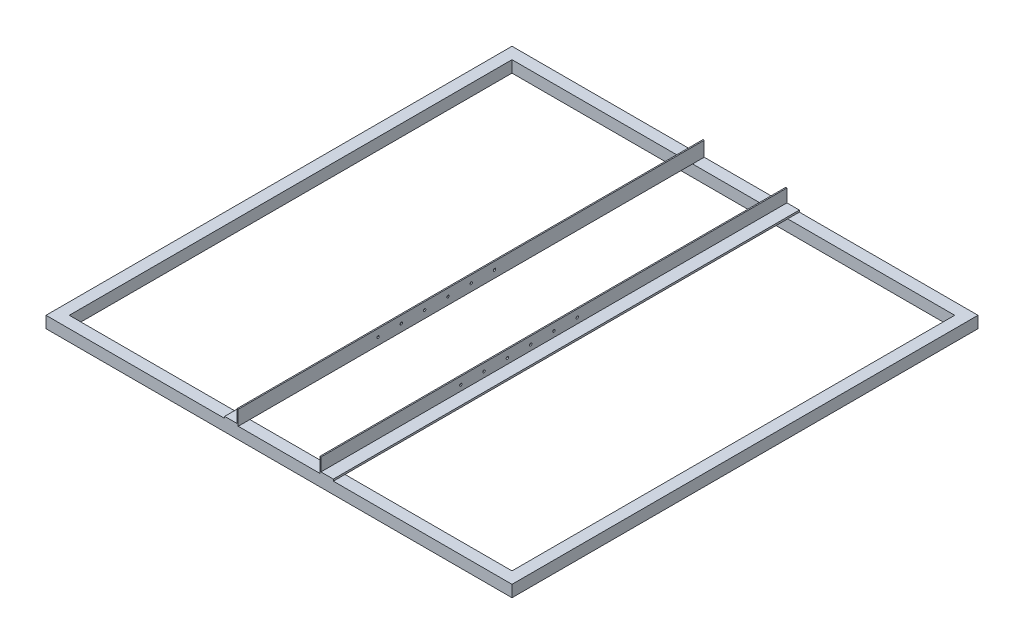
ISO-10303-21;
HEADER;
FILE_DESCRIPTION(('STEP AP214'),'2;1');
FILE_NAME('part.step','',(''),(''),'','','');
FILE_SCHEMA(('AUTOMOTIVE_DESIGN { 1 0 10303 214 1 1 1 1 }'));
ENDSEC;
DATA;
#1=APPLICATION_CONTEXT('core data for automotive mechanical design processes');
#2=APPLICATION_PROTOCOL_DEFINITION('international standard','automotive_design',2000,#1);
#3=PRODUCT_CONTEXT('',#1,'mechanical');
#4=PRODUCT('Part','Part','',(#3));
#5=PRODUCT_RELATED_PRODUCT_CATEGORY('part','',(#4));
#6=PRODUCT_DEFINITION_FORMATION('','',#4);
#7=PRODUCT_DEFINITION_CONTEXT('part definition',#1,'design');
#8=PRODUCT_DEFINITION('design','',#6,#7);
#9=PRODUCT_DEFINITION_SHAPE('','',#8);
#10=(LENGTH_UNIT() NAMED_UNIT(*) SI_UNIT(.MILLI.,.METRE.));
#11=(NAMED_UNIT(*) PLANE_ANGLE_UNIT() SI_UNIT($,.RADIAN.));
#12=(NAMED_UNIT(*) SI_UNIT($,.STERADIAN.) SOLID_ANGLE_UNIT());
#13=UNCERTAINTY_MEASURE_WITH_UNIT(LENGTH_MEASURE(1.E-05),#10,'distance_accuracy_value','');
#14=(GEOMETRIC_REPRESENTATION_CONTEXT(3) GLOBAL_UNCERTAINTY_ASSIGNED_CONTEXT((#13)) GLOBAL_UNIT_ASSIGNED_CONTEXT((#10,
#11,#12)) REPRESENTATION_CONTEXT('',''));
#15=CARTESIAN_POINT('',(0.,0.,0.));
#16=DIRECTION('',(0.,0.,1.));
#17=DIRECTION('',(1.,0.,0.));
#18=AXIS2_PLACEMENT_3D('',#15,#16,#17);
#19=CARTESIAN_POINT('',(0.,20.,0.));
#20=DIRECTION('',(0.,1.,0.));
#21=DIRECTION('',(0.,0.,1.));
#22=AXIS2_PLACEMENT_3D('',#19,#20,#21);
#23=PLANE('',#22);
#24=DIRECTION('',(1.,0.,0.));
#25=VECTOR('',#24,1.);
#26=CARTESIAN_POINT('',(-400.,20.,400.));
#27=LINE('',#26,#25);
#28=CARTESIAN_POINT('',(-400.,20.,400.));
#29=VERTEX_POINT('',#28);
#30=CARTESIAN_POINT('',(-93.2999999999998,20.,400.));
#31=VERTEX_POINT('',#30);
#32=EDGE_CURVE('E58',#29,#31,#27,.T.);
#33=ORIENTED_EDGE('',*,*,#32,.T.);
#34=DIRECTION('',(0.,0.,1.));
#35=VECTOR('',#34,1.);
#36=CARTESIAN_POINT('',(-93.2999999999998,20.,400.));
#37=LINE('',#36,#35);
#38=CARTESIAN_POINT('',(-93.2999999999998,20.,380.));
#39=VERTEX_POINT('',#38);
#40=EDGE_CURVE('E227',#39,#31,#37,.T.);
#41=ORIENTED_EDGE('',*,*,#40,.F.);
#42=DIRECTION('',(1.,0.,0.));
#43=VECTOR('',#42,1.);
#44=CARTESIAN_POINT('',(380.,20.,380.));
#45=LINE('',#44,#43);
#46=CARTESIAN_POINT('',(-380.,20.,380.));
#47=VERTEX_POINT('',#46);
#48=EDGE_CURVE('E440',#47,#39,#45,.T.);
#49=ORIENTED_EDGE('',*,*,#48,.F.);
#50=DIRECTION('',(0.,0.,1.));
#51=VECTOR('',#50,1.);
#52=CARTESIAN_POINT('',(-380.,20.,-380.));
#53=LINE('',#52,#51);
#54=CARTESIAN_POINT('',(-380.,20.,-380.));
#55=VERTEX_POINT('',#54);
#56=EDGE_CURVE('E361',#55,#47,#53,.T.);
#57=ORIENTED_EDGE('',*,*,#56,.F.);
#58=DIRECTION('',(-1.,0.,0.));
#59=VECTOR('',#58,1.);
#60=CARTESIAN_POINT('',(380.,20.,-380.));
#61=LINE('',#60,#59);
#62=CARTESIAN_POINT('',(-93.2999999999998,20.,-380.));
#63=VERTEX_POINT('',#62);
#64=EDGE_CURVE('E437',#63,#55,#61,.T.);
#65=ORIENTED_EDGE('',*,*,#64,.F.);
#66=CARTESIAN_POINT('',(-93.2999999999998,20.,-400.));
#67=VERTEX_POINT('',#66);
#68=EDGE_CURVE('E51',#67,#63,#37,.T.);
#69=ORIENTED_EDGE('',*,*,#68,.F.);
#70=DIRECTION('',(-1.,0.,0.));
#71=VECTOR('',#70,1.);
#72=CARTESIAN_POINT('',(-400.,20.,-400.));
#73=LINE('',#72,#71);
#74=CARTESIAN_POINT('',(-400.,20.,-400.));
#75=VERTEX_POINT('',#74);
#76=EDGE_CURVE('E37',#67,#75,#73,.T.);
#77=ORIENTED_EDGE('',*,*,#76,.T.);
#78=DIRECTION('',(0.,0.,1.));
#79=VECTOR('',#78,1.);
#80=CARTESIAN_POINT('',(-400.,20.,-400.));
#81=LINE('',#80,#79);
#82=EDGE_CURVE('E392',#75,#29,#81,.T.);
#83=ORIENTED_EDGE('',*,*,#82,.T.);
#84=EDGE_LOOP('',(#33,#41,#49,#57,#65,#69,#77,#83));
#85=FACE_BOUND('',#84,.T.);
#86=ADVANCED_FACE('F33',(#85),#23,.T.);
#87=CARTESIAN_POINT('',(400.,20.,-400.));
#88=VERTEX_POINT('',#87);
#89=CARTESIAN_POINT('',(93.3000000000001,20.,-400.));
#90=VERTEX_POINT('',#89);
#91=EDGE_CURVE('E402',#88,#90,#73,.T.);
#92=ORIENTED_EDGE('',*,*,#91,.T.);
#93=DIRECTION('',(0.,0.,-1.));
#94=VECTOR('',#93,1.);
#95=CARTESIAN_POINT('',(93.2999999999999,20.,-400.));
#96=LINE('',#95,#94);
#97=CARTESIAN_POINT('',(93.3000000000001,20.,-380.));
#98=VERTEX_POINT('',#97);
#99=EDGE_CURVE('E214',#98,#90,#96,.T.);
#100=ORIENTED_EDGE('',*,*,#99,.F.);
#101=CARTESIAN_POINT('',(380.,20.,-380.));
#102=VERTEX_POINT('',#101);
#103=EDGE_CURVE('E422',#102,#98,#61,.T.);
#104=ORIENTED_EDGE('',*,*,#103,.F.);
#105=DIRECTION('',(0.,0.,-1.));
#106=VECTOR('',#105,1.);
#107=CARTESIAN_POINT('',(380.,20.,-380.));
#108=LINE('',#107,#106);
#109=CARTESIAN_POINT('',(380.,20.,380.));
#110=VERTEX_POINT('',#109);
#111=EDGE_CURVE('E438',#110,#102,#108,.T.);
#112=ORIENTED_EDGE('',*,*,#111,.F.);
#113=CARTESIAN_POINT('',(93.3000000000001,20.,380.));
#114=VERTEX_POINT('',#113);
#115=EDGE_CURVE('E443',#114,#110,#45,.T.);
#116=ORIENTED_EDGE('',*,*,#115,.F.);
#117=CARTESIAN_POINT('',(93.3000000000001,20.,400.));
#118=VERTEX_POINT('',#117);
#119=EDGE_CURVE('E233',#118,#114,#96,.T.);
#120=ORIENTED_EDGE('',*,*,#119,.F.);
#121=CARTESIAN_POINT('',(400.,20.,400.));
#122=VERTEX_POINT('',#121);
#123=EDGE_CURVE('E388',#118,#122,#27,.T.);
#124=ORIENTED_EDGE('',*,*,#123,.T.);
#125=DIRECTION('',(0.,0.,-1.));
#126=VECTOR('',#125,1.);
#127=CARTESIAN_POINT('',(400.,20.,-400.));
#128=LINE('',#127,#126);
#129=EDGE_CURVE('E406',#122,#88,#128,.T.);
#130=ORIENTED_EDGE('',*,*,#129,.T.);
#131=EDGE_LOOP('',(#92,#100,#104,#112,#116,#120,#124,#130));
#132=FACE_BOUND('',#131,.T.);
#133=ADVANCED_FACE('F461',(#132),#23,.T.);
#134=CARTESIAN_POINT('',(70.,20.,-400.));
#135=VERTEX_POINT('',#134);
#136=CARTESIAN_POINT('',(-70.0000000000001,20.,-400.));
#137=VERTEX_POINT('',#136);
#138=EDGE_CURVE('E399',#135,#137,#73,.T.);
#139=ORIENTED_EDGE('',*,*,#138,.T.);
#140=DIRECTION('',(0.,0.,-1.));
#141=VECTOR('',#140,1.);
#142=CARTESIAN_POINT('',(-70.0000000000001,20.,-400.));
#143=LINE('',#142,#141);
#144=CARTESIAN_POINT('',(-70.0000000000001,20.,-380.));
#145=VERTEX_POINT('',#144);
#146=EDGE_CURVE('E321',#145,#137,#143,.T.);
#147=ORIENTED_EDGE('',*,*,#146,.F.);
#148=CARTESIAN_POINT('',(70.,20.,-380.));
#149=VERTEX_POINT('',#148);
#150=EDGE_CURVE('E559',#149,#145,#61,.T.);
#151=ORIENTED_EDGE('',*,*,#150,.F.);
#152=DIRECTION('',(0.,0.,1.));
#153=VECTOR('',#152,1.);
#154=CARTESIAN_POINT('',(70.,20.,-400.));
#155=LINE('',#154,#153);
#156=EDGE_CURVE('E351',#135,#149,#155,.T.);
#157=ORIENTED_EDGE('',*,*,#156,.F.);
#158=EDGE_LOOP('',(#139,#147,#151,#157));
#159=FACE_BOUND('',#158,.T.);
#160=ADVANCED_FACE('F546',(#159),#23,.T.);
#161=CARTESIAN_POINT('',(-69.9999999999998,20.,380.));
#162=VERTEX_POINT('',#161);
#163=CARTESIAN_POINT('',(70.,20.,380.));
#164=VERTEX_POINT('',#163);
#165=EDGE_CURVE('E442',#162,#164,#45,.T.);
#166=ORIENTED_EDGE('',*,*,#165,.F.);
#167=CARTESIAN_POINT('',(-69.9999999999999,20.,400.));
#168=VERTEX_POINT('',#167);
#169=EDGE_CURVE('E326',#168,#162,#143,.T.);
#170=ORIENTED_EDGE('',*,*,#169,.F.);
#171=CARTESIAN_POINT('',(70.,20.,400.));
#172=VERTEX_POINT('',#171);
#173=EDGE_CURVE('E386',#168,#172,#27,.T.);
#174=ORIENTED_EDGE('',*,*,#173,.T.);
#175=EDGE_CURVE('E11',#164,#172,#155,.T.);
#176=ORIENTED_EDGE('',*,*,#175,.F.);
#177=EDGE_LOOP('',(#166,#170,#174,#176));
#178=FACE_BOUND('',#177,.T.);
#179=ADVANCED_FACE('F503',(#178),#23,.T.);
#180=CARTESIAN_POINT('',(0.,0.,0.));
#181=DIRECTION('',(0.,1.,0.));
#182=DIRECTION('',(0.,0.,1.));
#183=AXIS2_PLACEMENT_3D('',#180,#181,#182);
#184=PLANE('',#183);
#185=DIRECTION('',(0.,0.,-1.));
#186=VECTOR('',#185,1.);
#187=CARTESIAN_POINT('',(400.,0.,-400.));
#188=LINE('',#187,#186);
#189=CARTESIAN_POINT('',(400.,0.,400.));
#190=VERTEX_POINT('',#189);
#191=CARTESIAN_POINT('',(400.,0.,-400.));
#192=VERTEX_POINT('',#191);
#193=EDGE_CURVE('E393',#190,#192,#188,.T.);
#194=ORIENTED_EDGE('',*,*,#193,.F.);
#195=DIRECTION('',(1.,0.,0.));
#196=VECTOR('',#195,1.);
#197=CARTESIAN_POINT('',(-400.,0.,400.));
#198=LINE('',#197,#196);
#199=CARTESIAN_POINT('',(-400.,0.,400.));
#200=VERTEX_POINT('',#199);
#201=EDGE_CURVE('E411',#200,#190,#198,.T.);
#202=ORIENTED_EDGE('',*,*,#201,.F.);
#203=DIRECTION('',(0.,0.,1.));
#204=VECTOR('',#203,1.);
#205=CARTESIAN_POINT('',(-400.,0.,-400.));
#206=LINE('',#205,#204);
#207=CARTESIAN_POINT('',(-400.,0.,-400.));
#208=VERTEX_POINT('',#207);
#209=EDGE_CURVE('E528',#208,#200,#206,.T.);
#210=ORIENTED_EDGE('',*,*,#209,.F.);
#211=DIRECTION('',(-1.,0.,0.));
#212=VECTOR('',#211,1.);
#213=CARTESIAN_POINT('',(-400.,0.,-400.));
#214=LINE('',#213,#212);
#215=EDGE_CURVE('E531',#192,#208,#214,.T.);
#216=ORIENTED_EDGE('',*,*,#215,.F.);
#217=EDGE_LOOP('',(#194,#202,#210,#216));
#218=FACE_BOUND('',#217,.T.);
#219=DIRECTION('',(0.,0.,1.));
#220=VECTOR('',#219,1.);
#221=CARTESIAN_POINT('',(-380.,0.,-380.));
#222=LINE('',#221,#220);
#223=CARTESIAN_POINT('',(-380.,0.,-380.));
#224=VERTEX_POINT('',#223);
#225=CARTESIAN_POINT('',(-380.,0.,380.));
#226=VERTEX_POINT('',#225);
#227=EDGE_CURVE('E383',#224,#226,#222,.T.);
#228=ORIENTED_EDGE('',*,*,#227,.T.);
#229=DIRECTION('',(1.,0.,0.));
#230=VECTOR('',#229,1.);
#231=CARTESIAN_POINT('',(380.,0.,380.));
#232=LINE('',#231,#230);
#233=CARTESIAN_POINT('',(380.,0.,380.));
#234=VERTEX_POINT('',#233);
#235=EDGE_CURVE('E429',#226,#234,#232,.T.);
#236=ORIENTED_EDGE('',*,*,#235,.T.);
#237=DIRECTION('',(0.,0.,-1.));
#238=VECTOR('',#237,1.);
#239=CARTESIAN_POINT('',(380.,0.,-380.));
#240=LINE('',#239,#238);
#241=CARTESIAN_POINT('',(380.,0.,-380.));
#242=VERTEX_POINT('',#241);
#243=EDGE_CURVE('E426',#234,#242,#240,.T.);
#244=ORIENTED_EDGE('',*,*,#243,.T.);
#245=DIRECTION('',(-1.,0.,0.));
#246=VECTOR('',#245,1.);
#247=CARTESIAN_POINT('',(380.,0.,-380.));
#248=LINE('',#247,#246);
#249=EDGE_CURVE('E423',#242,#224,#248,.T.);
#250=ORIENTED_EDGE('',*,*,#249,.T.);
#251=EDGE_LOOP('',(#228,#236,#244,#250));
#252=FACE_BOUND('',#251,.T.);
#253=ADVANCED_FACE('F526',(#218,#252),#184,.F.);
#254=CARTESIAN_POINT('',(400.,20.,-400.));
#255=DIRECTION('',(-1.,0.,0.));
#256=DIRECTION('',(0.,0.,1.));
#257=AXIS2_PLACEMENT_3D('',#254,#255,#256);
#258=PLANE('',#257);
#259=ORIENTED_EDGE('',*,*,#193,.T.);
#260=DIRECTION('',(0.,-1.,0.));
#261=VECTOR('',#260,1.);
#262=CARTESIAN_POINT('',(400.,20.,-400.));
#263=LINE('',#262,#261);
#264=EDGE_CURVE('E43',#88,#192,#263,.T.);
#265=ORIENTED_EDGE('',*,*,#264,.F.);
#266=ORIENTED_EDGE('',*,*,#129,.F.);
#267=DIRECTION('',(0.,-1.,0.));
#268=VECTOR('',#267,1.);
#269=CARTESIAN_POINT('',(400.,20.,400.));
#270=LINE('',#269,#268);
#271=EDGE_CURVE('E398',#122,#190,#270,.T.);
#272=ORIENTED_EDGE('',*,*,#271,.T.);
#273=EDGE_LOOP('',(#259,#265,#266,#272));
#274=FACE_BOUND('',#273,.T.);
#275=ADVANCED_FACE('F35',(#274),#258,.F.);
#276=CARTESIAN_POINT('',(-400.,20.,-400.));
#277=DIRECTION('',(0.,0.,1.));
#278=DIRECTION('',(1.,0.,0.));
#279=AXIS2_PLACEMENT_3D('',#276,#277,#278);
#280=PLANE('',#279);
#281=ORIENTED_EDGE('',*,*,#76,.F.);
#282=DIRECTION('',(0.,-1.,0.));
#283=VECTOR('',#282,1.);
#284=CARTESIAN_POINT('',(-93.2999999999998,23.09,-400.));
#285=LINE('',#284,#283);
#286=CARTESIAN_POINT('',(-93.2999999999998,23.09,-400.));
#287=VERTEX_POINT('',#286);
#288=EDGE_CURVE('E210',#287,#67,#285,.T.);
#289=ORIENTED_EDGE('',*,*,#288,.F.);
#290=DIRECTION('',(-1.,0.,0.));
#291=VECTOR('',#290,1.);
#292=CARTESIAN_POINT('',(-71.9999999999998,23.09,-400.));
#293=LINE('',#292,#291);
#294=CARTESIAN_POINT('',(-71.9999999999999,23.09,-400.));
#295=VERTEX_POINT('',#294);
#296=EDGE_CURVE('E198',#295,#287,#293,.T.);
#297=ORIENTED_EDGE('',*,*,#296,.F.);
#298=DIRECTION('',(0.,-1.,0.));
#299=VECTOR('',#298,1.);
#300=CARTESIAN_POINT('',(-71.9999999999999,45.3,-400.));
#301=LINE('',#300,#299);
#302=CARTESIAN_POINT('',(-71.9999999999999,45.3,-400.));
#303=VERTEX_POINT('',#302);
#304=EDGE_CURVE('E339',#303,#295,#301,.T.);
#305=ORIENTED_EDGE('',*,*,#304,.F.);
#306=DIRECTION('',(-1.,0.,0.));
#307=VECTOR('',#306,1.);
#308=CARTESIAN_POINT('',(-70.0000000000001,45.3,-400.));
#309=LINE('',#308,#307);
#310=CARTESIAN_POINT('',(-70.0000000000001,45.3,-400.));
#311=VERTEX_POINT('',#310);
#312=EDGE_CURVE('E325',#311,#303,#309,.T.);
#313=ORIENTED_EDGE('',*,*,#312,.F.);
#314=DIRECTION('',(0.,-1.,0.));
#315=VECTOR('',#314,1.);
#316=CARTESIAN_POINT('',(-70.0000000000001,45.3,-400.));
#317=LINE('',#316,#315);
#318=EDGE_CURVE('E341',#311,#137,#317,.T.);
#319=ORIENTED_EDGE('',*,*,#318,.T.);
#320=ORIENTED_EDGE('',*,*,#138,.F.);
#321=DIRECTION('',(0.,-1.,0.));
#322=VECTOR('',#321,1.);
#323=CARTESIAN_POINT('',(70.,45.3,-400.));
#324=LINE('',#323,#322);
#325=CARTESIAN_POINT('',(70.,45.3,-400.));
#326=VERTEX_POINT('',#325);
#327=EDGE_CURVE('E357',#326,#135,#324,.T.);
#328=ORIENTED_EDGE('',*,*,#327,.F.);
#329=DIRECTION('',(-1.,0.,0.));
#330=VECTOR('',#329,1.);
#331=CARTESIAN_POINT('',(70.,45.3,-400.));
#332=LINE('',#331,#330);
#333=CARTESIAN_POINT('',(71.9999999999999,45.3,-400.));
#334=VERTEX_POINT('',#333);
#335=EDGE_CURVE('E355',#334,#326,#332,.T.);
#336=ORIENTED_EDGE('',*,*,#335,.F.);
#337=DIRECTION('',(0.,-1.,0.));
#338=VECTOR('',#337,1.);
#339=CARTESIAN_POINT('',(71.9999999999999,45.3,-400.));
#340=LINE('',#339,#338);
#341=CARTESIAN_POINT('',(71.9999999999999,23.09,-400.));
#342=VERTEX_POINT('',#341);
#343=EDGE_CURVE('E373',#334,#342,#340,.T.);
#344=ORIENTED_EDGE('',*,*,#343,.T.);
#345=DIRECTION('',(-1.,0.,0.));
#346=VECTOR('',#345,1.);
#347=CARTESIAN_POINT('',(71.9999999999999,23.09,-400.));
#348=LINE('',#347,#346);
#349=CARTESIAN_POINT('',(93.2999999999999,23.09,-400.));
#350=VERTEX_POINT('',#349);
#351=EDGE_CURVE('E237',#350,#342,#348,.T.);
#352=ORIENTED_EDGE('',*,*,#351,.F.);
#353=DIRECTION('',(0.,-1.,0.));
#354=VECTOR('',#353,1.);
#355=CARTESIAN_POINT('',(93.2999999999999,23.09,-400.));
#356=LINE('',#355,#354);
#357=EDGE_CURVE('E240',#350,#90,#356,.T.);
#358=ORIENTED_EDGE('',*,*,#357,.T.);
#359=ORIENTED_EDGE('',*,*,#91,.F.);
#360=ORIENTED_EDGE('',*,*,#264,.T.);
#361=ORIENTED_EDGE('',*,*,#215,.T.);
#362=DIRECTION('',(0.,-1.,0.));
#363=VECTOR('',#362,1.);
#364=CARTESIAN_POINT('',(-400.,20.,-400.));
#365=LINE('',#364,#363);
#366=EDGE_CURVE('E521',#75,#208,#365,.T.);
#367=ORIENTED_EDGE('',*,*,#366,.F.);
#368=EDGE_LOOP('',(#281,#289,#297,#305,#313,#319,#320,#328,#336,#344,#352,#358,#359,#360,#361,#367));
#369=FACE_BOUND('',#368,.T.);
#370=ADVANCED_FACE('F211',(#369),#280,.F.);
#371=CARTESIAN_POINT('',(-400.,20.,-400.));
#372=DIRECTION('',(1.,0.,0.));
#373=DIRECTION('',(0.,0.,-1.));
#374=AXIS2_PLACEMENT_3D('',#371,#372,#373);
#375=PLANE('',#374);
#376=ORIENTED_EDGE('',*,*,#209,.T.);
#377=DIRECTION('',(0.,-1.,0.));
#378=VECTOR('',#377,1.);
#379=CARTESIAN_POINT('',(-400.,20.,400.));
#380=LINE('',#379,#378);
#381=EDGE_CURVE('E518',#29,#200,#380,.T.);
#382=ORIENTED_EDGE('',*,*,#381,.F.);
#383=ORIENTED_EDGE('',*,*,#82,.F.);
#384=ORIENTED_EDGE('',*,*,#366,.T.);
#385=EDGE_LOOP('',(#376,#382,#383,#384));
#386=FACE_BOUND('',#385,.T.);
#387=ADVANCED_FACE('F542',(#386),#375,.F.);
#388=CARTESIAN_POINT('',(-400.,20.,400.));
#389=DIRECTION('',(0.,0.,-1.));
#390=DIRECTION('',(-1.,0.,0.));
#391=AXIS2_PLACEMENT_3D('',#388,#389,#390);
#392=PLANE('',#391);
#393=ORIENTED_EDGE('',*,*,#123,.F.);
#394=DIRECTION('',(0.,-1.,0.));
#395=VECTOR('',#394,1.);
#396=CARTESIAN_POINT('',(93.3,23.09,400.));
#397=LINE('',#396,#395);
#398=CARTESIAN_POINT('',(93.3,23.09,400.));
#399=VERTEX_POINT('',#398);
#400=EDGE_CURVE('E246',#399,#118,#397,.T.);
#401=ORIENTED_EDGE('',*,*,#400,.F.);
#402=DIRECTION('',(1.,0.,0.));
#403=VECTOR('',#402,1.);
#404=CARTESIAN_POINT('',(71.9999999999999,23.09,400.));
#405=LINE('',#404,#403);
#406=CARTESIAN_POINT('',(72.,23.09,400.));
#407=VERTEX_POINT('',#406);
#408=EDGE_CURVE('E232',#407,#399,#405,.T.);
#409=ORIENTED_EDGE('',*,*,#408,.F.);
#410=DIRECTION('',(0.,-1.,0.));
#411=VECTOR('',#410,1.);
#412=CARTESIAN_POINT('',(72.,45.3,400.));
#413=LINE('',#412,#411);
#414=CARTESIAN_POINT('',(72.,45.3,400.));
#415=VERTEX_POINT('',#414);
#416=EDGE_CURVE('E376',#415,#407,#413,.T.);
#417=ORIENTED_EDGE('',*,*,#416,.F.);
#418=DIRECTION('',(1.,0.,0.));
#419=VECTOR('',#418,1.);
#420=CARTESIAN_POINT('',(70.,45.3,400.));
#421=LINE('',#420,#419);
#422=CARTESIAN_POINT('',(70.,45.3,400.));
#423=VERTEX_POINT('',#422);
#424=EDGE_CURVE('E350',#423,#415,#421,.T.);
#425=ORIENTED_EDGE('',*,*,#424,.F.);
#426=DIRECTION('',(0.,-1.,0.));
#427=VECTOR('',#426,1.);
#428=CARTESIAN_POINT('',(70.,45.3,400.));
#429=LINE('',#428,#427);
#430=EDGE_CURVE('E378',#423,#172,#429,.T.);
#431=ORIENTED_EDGE('',*,*,#430,.T.);
#432=ORIENTED_EDGE('',*,*,#173,.F.);
#433=DIRECTION('',(0.,-1.,0.));
#434=VECTOR('',#433,1.);
#435=CARTESIAN_POINT('',(-69.9999999999999,45.3,400.));
#436=LINE('',#435,#434);
#437=CARTESIAN_POINT('',(-69.9999999999999,45.3,400.));
#438=VERTEX_POINT('',#437);
#439=EDGE_CURVE('E332',#438,#168,#436,.T.);
#440=ORIENTED_EDGE('',*,*,#439,.F.);
#441=DIRECTION('',(1.,0.,0.));
#442=VECTOR('',#441,1.);
#443=CARTESIAN_POINT('',(-69.9999999999999,45.3,400.));
#444=LINE('',#443,#442);
#445=CARTESIAN_POINT('',(-71.9999999999998,45.3,400.));
#446=VERTEX_POINT('',#445);
#447=EDGE_CURVE('E330',#446,#438,#444,.T.);
#448=ORIENTED_EDGE('',*,*,#447,.F.);
#449=DIRECTION('',(0.,-1.,0.));
#450=VECTOR('',#449,1.);
#451=CARTESIAN_POINT('',(-71.9999999999998,45.3,400.));
#452=LINE('',#451,#450);
#453=CARTESIAN_POINT('',(-71.9999999999998,23.09,400.));
#454=VERTEX_POINT('',#453);
#455=EDGE_CURVE('E336',#446,#454,#452,.T.);
#456=ORIENTED_EDGE('',*,*,#455,.T.);
#457=DIRECTION('',(1.,0.,0.));
#458=VECTOR('',#457,1.);
#459=CARTESIAN_POINT('',(-71.9999999999998,23.09,400.));
#460=LINE('',#459,#458);
#461=CARTESIAN_POINT('',(-93.2999999999998,23.09,400.));
#462=VERTEX_POINT('',#461);
#463=EDGE_CURVE('E220',#462,#454,#460,.T.);
#464=ORIENTED_EDGE('',*,*,#463,.F.);
#465=DIRECTION('',(0.,-1.,0.));
#466=VECTOR('',#465,1.);
#467=CARTESIAN_POINT('',(-93.2999999999998,23.09,400.));
#468=LINE('',#467,#466);
#469=EDGE_CURVE('E215',#462,#31,#468,.T.);
#470=ORIENTED_EDGE('',*,*,#469,.T.);
#471=ORIENTED_EDGE('',*,*,#32,.F.);
#472=ORIENTED_EDGE('',*,*,#381,.T.);
#473=ORIENTED_EDGE('',*,*,#201,.T.);
#474=ORIENTED_EDGE('',*,*,#271,.F.);
#475=EDGE_LOOP('',(#393,#401,#409,#417,#425,#431,#432,#440,#448,#456,#464,#470,#471,#472,#473,#474));
#476=FACE_BOUND('',#475,.T.);
#477=ADVANCED_FACE('F476',(#476),#392,.F.);
#478=CARTESIAN_POINT('',(-380.,20.,-380.));
#479=DIRECTION('',(1.,0.,0.));
#480=DIRECTION('',(0.,0.,-1.));
#481=AXIS2_PLACEMENT_3D('',#478,#479,#480);
#482=PLANE('',#481);
#483=ORIENTED_EDGE('',*,*,#227,.F.);
#484=DIRECTION('',(0.,-1.,0.));
#485=VECTOR('',#484,1.);
#486=CARTESIAN_POINT('',(-380.,20.,-380.));
#487=LINE('',#486,#485);
#488=EDGE_CURVE('E419',#55,#224,#487,.T.);
#489=ORIENTED_EDGE('',*,*,#488,.F.);
#490=ORIENTED_EDGE('',*,*,#56,.T.);
#491=DIRECTION('',(0.,-1.,0.));
#492=VECTOR('',#491,1.);
#493=CARTESIAN_POINT('',(-380.,20.,380.));
#494=LINE('',#493,#492);
#495=EDGE_CURVE('E412',#47,#226,#494,.T.);
#496=ORIENTED_EDGE('',*,*,#495,.T.);
#497=EDGE_LOOP('',(#483,#489,#490,#496));
#498=FACE_BOUND('',#497,.T.);
#499=ADVANCED_FACE('F568',(#498),#482,.T.);
#500=CARTESIAN_POINT('',(380.,20.,380.));
#501=DIRECTION('',(0.,0.,-1.));
#502=DIRECTION('',(-1.,0.,0.));
#503=AXIS2_PLACEMENT_3D('',#500,#501,#502);
#504=PLANE('',#503);
#505=ORIENTED_EDGE('',*,*,#235,.F.);
#506=ORIENTED_EDGE('',*,*,#495,.F.);
#507=ORIENTED_EDGE('',*,*,#48,.T.);
#508=DIRECTION('',(-1.,0.,0.));
#509=VECTOR('',#508,1.);
#510=CARTESIAN_POINT('',(380.,20.,380.));
#511=LINE('',#510,#509);
#512=EDGE_CURVE('E344',#162,#39,#511,.T.);
#513=ORIENTED_EDGE('',*,*,#512,.F.);
#514=ORIENTED_EDGE('',*,*,#165,.T.);
#515=EDGE_CURVE('E444',#164,#114,#45,.T.);
#516=ORIENTED_EDGE('',*,*,#515,.T.);
#517=ORIENTED_EDGE('',*,*,#115,.T.);
#518=DIRECTION('',(0.,-1.,0.));
#519=VECTOR('',#518,1.);
#520=CARTESIAN_POINT('',(380.,20.,380.));
#521=LINE('',#520,#519);
#522=EDGE_CURVE('E415',#110,#234,#521,.T.);
#523=ORIENTED_EDGE('',*,*,#522,.T.);
#524=EDGE_LOOP('',(#505,#506,#507,#513,#514,#516,#517,#523));
#525=FACE_BOUND('',#524,.T.);
#526=ADVANCED_FACE('F452',(#525),#504,.T.);
#527=CARTESIAN_POINT('',(380.,20.,-380.));
#528=DIRECTION('',(-1.,0.,0.));
#529=DIRECTION('',(0.,0.,1.));
#530=AXIS2_PLACEMENT_3D('',#527,#528,#529);
#531=PLANE('',#530);
#532=ORIENTED_EDGE('',*,*,#243,.F.);
#533=ORIENTED_EDGE('',*,*,#522,.F.);
#534=ORIENTED_EDGE('',*,*,#111,.T.);
#535=DIRECTION('',(0.,-1.,0.));
#536=VECTOR('',#535,1.);
#537=CARTESIAN_POINT('',(380.,20.,-380.));
#538=LINE('',#537,#536);
#539=EDGE_CURVE('E417',#102,#242,#538,.T.);
#540=ORIENTED_EDGE('',*,*,#539,.T.);
#541=EDGE_LOOP('',(#532,#533,#534,#540));
#542=FACE_BOUND('',#541,.T.);
#543=ADVANCED_FACE('F566',(#542),#531,.T.);
#544=CARTESIAN_POINT('',(380.,20.,-380.));
#545=DIRECTION('',(0.,0.,1.));
#546=DIRECTION('',(1.,0.,0.));
#547=AXIS2_PLACEMENT_3D('',#544,#545,#546);
#548=PLANE('',#547);
#549=ORIENTED_EDGE('',*,*,#249,.F.);
#550=ORIENTED_EDGE('',*,*,#539,.F.);
#551=ORIENTED_EDGE('',*,*,#103,.T.);
#552=EDGE_CURVE('E436',#98,#149,#61,.T.);
#553=ORIENTED_EDGE('',*,*,#552,.T.);
#554=ORIENTED_EDGE('',*,*,#150,.T.);
#555=EDGE_CURVE('E561',#145,#63,#61,.T.);
#556=ORIENTED_EDGE('',*,*,#555,.T.);
#557=ORIENTED_EDGE('',*,*,#64,.T.);
#558=ORIENTED_EDGE('',*,*,#488,.T.);
#559=EDGE_LOOP('',(#549,#550,#551,#553,#554,#556,#557,#558));
#560=FACE_BOUND('',#559,.T.);
#561=ADVANCED_FACE('F563',(#560),#548,.T.);
#562=CARTESIAN_POINT('',(70.,45.3,-400.));
#563=DIRECTION('',(1.,0.,0.));
#564=DIRECTION('',(0.,0.,-1.));
#565=AXIS2_PLACEMENT_3D('',#562,#563,#564);
#566=PLANE('',#565);
#567=CARTESIAN_POINT('',(70.,32.65,160.));
#568=DIRECTION('',(1.,0.,0.));
#569=DIRECTION('',(0.,0.,-1.));
#570=AXIS2_PLACEMENT_3D('',#567,#568,#569);
#571=CIRCLE('',#570,2.09999999999999);
#572=CARTESIAN_POINT('',(70.,32.65,157.9));
#573=VERTEX_POINT('',#572);
#574=EDGE_CURVE('E258',#573,#573,#571,.T.);
#575=ORIENTED_EDGE('',*,*,#574,.T.);
#576=EDGE_LOOP('',(#575));
#577=FACE_BOUND('',#576,.T.);
#578=CARTESIAN_POINT('',(70.,32.65,120.));
#579=DIRECTION('',(1.,0.,0.));
#580=DIRECTION('',(0.,0.,-1.));
#581=AXIS2_PLACEMENT_3D('',#578,#579,#580);
#582=CIRCLE('',#581,2.1);
#583=CARTESIAN_POINT('',(70.,32.65,117.9));
#584=VERTEX_POINT('',#583);
#585=EDGE_CURVE('E270',#584,#584,#582,.T.);
#586=ORIENTED_EDGE('',*,*,#585,.T.);
#587=EDGE_LOOP('',(#586));
#588=FACE_BOUND('',#587,.T.);
#589=CARTESIAN_POINT('',(70.,32.65,80.));
#590=DIRECTION('',(1.,0.,0.));
#591=DIRECTION('',(0.,0.,-1.));
#592=AXIS2_PLACEMENT_3D('',#589,#590,#591);
#593=CIRCLE('',#592,2.1);
#594=CARTESIAN_POINT('',(70.,32.65,77.8999999999999));
#595=VERTEX_POINT('',#594);
#596=EDGE_CURVE('E282',#595,#595,#593,.T.);
#597=ORIENTED_EDGE('',*,*,#596,.T.);
#598=EDGE_LOOP('',(#597));
#599=FACE_BOUND('',#598,.T.);
#600=CARTESIAN_POINT('',(70.,32.65,40.));
#601=DIRECTION('',(1.,0.,0.));
#602=DIRECTION('',(0.,0.,-1.));
#603=AXIS2_PLACEMENT_3D('',#600,#601,#602);
#604=CIRCLE('',#603,2.1);
#605=CARTESIAN_POINT('',(70.,32.65,37.9));
#606=VERTEX_POINT('',#605);
#607=EDGE_CURVE('E294',#606,#606,#604,.T.);
#608=ORIENTED_EDGE('',*,*,#607,.T.);
#609=EDGE_LOOP('',(#608));
#610=FACE_BOUND('',#609,.T.);
#611=CARTESIAN_POINT('',(70.,32.65,-40.));
#612=DIRECTION('',(1.,0.,0.));
#613=DIRECTION('',(0.,0.,-1.));
#614=AXIS2_PLACEMENT_3D('',#611,#612,#613);
#615=CIRCLE('',#614,2.1);
#616=CARTESIAN_POINT('',(70.,32.65,-42.1));
#617=VERTEX_POINT('',#616);
#618=EDGE_CURVE('E306',#617,#617,#615,.T.);
#619=ORIENTED_EDGE('',*,*,#618,.T.);
#620=EDGE_LOOP('',(#619));
#621=FACE_BOUND('',#620,.T.);
#622=CARTESIAN_POINT('',(70.,32.65,0.));
#623=DIRECTION('',(1.,0.,0.));
#624=DIRECTION('',(0.,0.,-1.));
#625=AXIS2_PLACEMENT_3D('',#622,#623,#624);
#626=CIRCLE('',#625,2.1);
#627=CARTESIAN_POINT('',(70.,32.65,-2.10000000000004));
#628=VERTEX_POINT('',#627);
#629=EDGE_CURVE('E318',#628,#628,#626,.T.);
#630=ORIENTED_EDGE('',*,*,#629,.T.);
#631=EDGE_LOOP('',(#630));
#632=FACE_BOUND('',#631,.T.);
#633=ORIENTED_EDGE('',*,*,#156,.T.);
#634=EDGE_CURVE('E346',#149,#164,#155,.T.);
#635=ORIENTED_EDGE('',*,*,#634,.T.);
#636=ORIENTED_EDGE('',*,*,#175,.T.);
#637=ORIENTED_EDGE('',*,*,#430,.F.);
#638=DIRECTION('',(0.,0.,1.));
#639=VECTOR('',#638,1.);
#640=CARTESIAN_POINT('',(70.,45.3,-400.));
#641=LINE('',#640,#639);
#642=EDGE_CURVE('E347',#326,#423,#641,.T.);
#643=ORIENTED_EDGE('',*,*,#642,.F.);
#644=ORIENTED_EDGE('',*,*,#327,.T.);
#645=EDGE_LOOP('',(#633,#635,#636,#637,#643,#644));
#646=FACE_BOUND('',#645,.T.);
#647=ADVANCED_FACE('F501',(#577,#588,#599,#610,#621,#632,#646),#566,.F.);
#648=CARTESIAN_POINT('',(71.9999999999999,45.3,-400.));
#649=DIRECTION('',(-1.,0.,0.));
#650=DIRECTION('',(0.,0.,1.));
#651=AXIS2_PLACEMENT_3D('',#648,#649,#650);
#652=PLANE('',#651);
#653=CARTESIAN_POINT('',(72.,32.65,160.));
#654=DIRECTION('',(-1.,0.,0.));
#655=DIRECTION('',(0.,0.,1.));
#656=AXIS2_PLACEMENT_3D('',#653,#654,#655);
#657=CIRCLE('',#656,2.09999999999999);
#658=CARTESIAN_POINT('',(72.,32.65,162.1));
#659=VERTEX_POINT('',#658);
#660=EDGE_CURVE('E255',#659,#659,#657,.T.);
#661=ORIENTED_EDGE('',*,*,#660,.T.);
#662=EDGE_LOOP('',(#661));
#663=FACE_BOUND('',#662,.T.);
#664=CARTESIAN_POINT('',(72.,32.65,120.));
#665=DIRECTION('',(-1.,0.,0.));
#666=DIRECTION('',(0.,0.,1.));
#667=AXIS2_PLACEMENT_3D('',#664,#665,#666);
#668=CIRCLE('',#667,2.1);
#669=CARTESIAN_POINT('',(72.,32.65,122.1));
#670=VERTEX_POINT('',#669);
#671=EDGE_CURVE('E267',#670,#670,#668,.T.);
#672=ORIENTED_EDGE('',*,*,#671,.T.);
#673=EDGE_LOOP('',(#672));
#674=FACE_BOUND('',#673,.T.);
#675=CARTESIAN_POINT('',(72.,32.65,80.));
#676=DIRECTION('',(-1.,0.,0.));
#677=DIRECTION('',(0.,0.,1.));
#678=AXIS2_PLACEMENT_3D('',#675,#676,#677);
#679=CIRCLE('',#678,2.1);
#680=CARTESIAN_POINT('',(72.,32.65,82.1));
#681=VERTEX_POINT('',#680);
#682=EDGE_CURVE('E279',#681,#681,#679,.T.);
#683=ORIENTED_EDGE('',*,*,#682,.T.);
#684=EDGE_LOOP('',(#683));
#685=FACE_BOUND('',#684,.T.);
#686=CARTESIAN_POINT('',(72.,32.65,40.));
#687=DIRECTION('',(-1.,0.,0.));
#688=DIRECTION('',(0.,0.,1.));
#689=AXIS2_PLACEMENT_3D('',#686,#687,#688);
#690=CIRCLE('',#689,2.1);
#691=CARTESIAN_POINT('',(72.,32.65,42.1));
#692=VERTEX_POINT('',#691);
#693=EDGE_CURVE('E291',#692,#692,#690,.T.);
#694=ORIENTED_EDGE('',*,*,#693,.T.);
#695=EDGE_LOOP('',(#694));
#696=FACE_BOUND('',#695,.T.);
#697=CARTESIAN_POINT('',(72.,32.65,-40.));
#698=DIRECTION('',(-1.,0.,0.));
#699=DIRECTION('',(0.,0.,1.));
#700=AXIS2_PLACEMENT_3D('',#697,#698,#699);
#701=CIRCLE('',#700,2.1);
#702=CARTESIAN_POINT('',(72.,32.65,-37.9));
#703=VERTEX_POINT('',#702);
#704=EDGE_CURVE('E303',#703,#703,#701,.T.);
#705=ORIENTED_EDGE('',*,*,#704,.T.);
#706=EDGE_LOOP('',(#705));
#707=FACE_BOUND('',#706,.T.);
#708=CARTESIAN_POINT('',(72.,32.65,0.));
#709=DIRECTION('',(-1.,0.,0.));
#710=DIRECTION('',(0.,0.,1.));
#711=AXIS2_PLACEMENT_3D('',#708,#709,#710);
#712=CIRCLE('',#711,2.1);
#713=CARTESIAN_POINT('',(72.,32.65,2.09999999999996));
#714=VERTEX_POINT('',#713);
#715=EDGE_CURVE('E315',#714,#714,#712,.T.);
#716=ORIENTED_EDGE('',*,*,#715,.T.);
#717=EDGE_LOOP('',(#716));
#718=FACE_BOUND('',#717,.T.);
#719=ORIENTED_EDGE('',*,*,#416,.T.);
#720=DIRECTION('',(0.,0.,1.));
#721=VECTOR('',#720,1.);
#722=CARTESIAN_POINT('',(71.9999999999999,23.09,-400.));
#723=LINE('',#722,#721);
#724=EDGE_CURVE('E229',#342,#407,#723,.T.);
#725=ORIENTED_EDGE('',*,*,#724,.F.);
#726=ORIENTED_EDGE('',*,*,#343,.F.);
#727=DIRECTION('',(0.,0.,-1.));
#728=VECTOR('',#727,1.);
#729=CARTESIAN_POINT('',(71.9999999999999,45.3,-400.));
#730=LINE('',#729,#728);
#731=EDGE_CURVE('E353',#415,#334,#730,.T.);
#732=ORIENTED_EDGE('',*,*,#731,.F.);
#733=EDGE_LOOP('',(#719,#725,#726,#732));
#734=FACE_BOUND('',#733,.T.);
#735=ADVANCED_FACE('F492',(#663,#674,#685,#696,#707,#718,#734),#652,.F.);
#736=CARTESIAN_POINT('',(0.,45.3,0.));
#737=DIRECTION('',(0.,1.,0.));
#738=DIRECTION('',(0.,0.,1.));
#739=AXIS2_PLACEMENT_3D('',#736,#737,#738);
#740=PLANE('',#739);
#741=ORIENTED_EDGE('',*,*,#642,.T.);
#742=ORIENTED_EDGE('',*,*,#424,.T.);
#743=ORIENTED_EDGE('',*,*,#731,.T.);
#744=ORIENTED_EDGE('',*,*,#335,.T.);
#745=EDGE_LOOP('',(#741,#742,#743,#744));
#746=FACE_BOUND('',#745,.T.);
#747=ADVANCED_FACE('F498',(#746),#740,.T.);
#748=CARTESIAN_POINT('',(0.,20.,0.));
#749=DIRECTION('',(0.,1.,0.));
#750=DIRECTION('',(0.,0.,1.));
#751=AXIS2_PLACEMENT_3D('',#748,#749,#750);
#752=PLANE('',#751);
#753=ORIENTED_EDGE('',*,*,#515,.F.);
#754=ORIENTED_EDGE('',*,*,#634,.F.);
#755=ORIENTED_EDGE('',*,*,#552,.F.);
#756=EDGE_CURVE('E243',#114,#98,#96,.T.);
#757=ORIENTED_EDGE('',*,*,#756,.F.);
#758=EDGE_LOOP('',(#753,#754,#755,#757));
#759=FACE_BOUND('',#758,.T.);
#760=ADVANCED_FACE('F465',(#759),#752,.F.);
#761=CARTESIAN_POINT('',(-70.0000000000001,45.3,-400.));
#762=DIRECTION('',(-1.,0.,0.));
#763=DIRECTION('',(0.,0.,1.));
#764=AXIS2_PLACEMENT_3D('',#761,#762,#763);
#765=PLANE('',#764);
#766=CARTESIAN_POINT('',(-69.9999999999999,32.65,160.));
#767=DIRECTION('',(-1.,0.,0.));
#768=DIRECTION('',(0.,0.,1.));
#769=AXIS2_PLACEMENT_3D('',#766,#767,#768);
#770=CIRCLE('',#769,2.09999999999999);
#771=CARTESIAN_POINT('',(-69.9999999999999,32.65,162.1));
#772=VERTEX_POINT('',#771);
#773=EDGE_CURVE('E252',#772,#772,#770,.T.);
#774=ORIENTED_EDGE('',*,*,#773,.T.);
#775=EDGE_LOOP('',(#774));
#776=FACE_BOUND('',#775,.T.);
#777=CARTESIAN_POINT('',(-70.,32.65,120.));
#778=DIRECTION('',(-1.,0.,0.));
#779=DIRECTION('',(0.,0.,1.));
#780=AXIS2_PLACEMENT_3D('',#777,#778,#779);
#781=CIRCLE('',#780,2.1);
#782=CARTESIAN_POINT('',(-70.,32.65,122.1));
#783=VERTEX_POINT('',#782);
#784=EDGE_CURVE('E264',#783,#783,#781,.T.);
#785=ORIENTED_EDGE('',*,*,#784,.T.);
#786=EDGE_LOOP('',(#785));
#787=FACE_BOUND('',#786,.T.);
#788=CARTESIAN_POINT('',(-70.,32.65,80.));
#789=DIRECTION('',(-1.,0.,0.));
#790=DIRECTION('',(0.,0.,1.));
#791=AXIS2_PLACEMENT_3D('',#788,#789,#790);
#792=CIRCLE('',#791,2.1);
#793=CARTESIAN_POINT('',(-70.,32.65,82.1));
#794=VERTEX_POINT('',#793);
#795=EDGE_CURVE('E276',#794,#794,#792,.T.);
#796=ORIENTED_EDGE('',*,*,#795,.T.);
#797=EDGE_LOOP('',(#796));
#798=FACE_BOUND('',#797,.T.);
#799=CARTESIAN_POINT('',(-70.,32.65,40.));
#800=DIRECTION('',(-1.,0.,0.));
#801=DIRECTION('',(0.,0.,1.));
#802=AXIS2_PLACEMENT_3D('',#799,#800,#801);
#803=CIRCLE('',#802,2.1);
#804=CARTESIAN_POINT('',(-70.,32.65,42.1));
#805=VERTEX_POINT('',#804);
#806=EDGE_CURVE('E288',#805,#805,#803,.T.);
#807=ORIENTED_EDGE('',*,*,#806,.T.);
#808=EDGE_LOOP('',(#807));
#809=FACE_BOUND('',#808,.T.);
#810=CARTESIAN_POINT('',(-70.,32.65,-40.));
#811=DIRECTION('',(-1.,0.,0.));
#812=DIRECTION('',(0.,0.,1.));
#813=AXIS2_PLACEMENT_3D('',#810,#811,#812);
#814=CIRCLE('',#813,2.1);
#815=CARTESIAN_POINT('',(-70.,32.65,-37.9));
#816=VERTEX_POINT('',#815);
#817=EDGE_CURVE('E300',#816,#816,#814,.T.);
#818=ORIENTED_EDGE('',*,*,#817,.T.);
#819=EDGE_LOOP('',(#818));
#820=FACE_BOUND('',#819,.T.);
#821=CARTESIAN_POINT('',(-70.,32.65,0.));
#822=DIRECTION('',(-1.,0.,0.));
#823=DIRECTION('',(0.,0.,1.));
#824=AXIS2_PLACEMENT_3D('',#821,#822,#823);
#825=CIRCLE('',#824,2.1);
#826=CARTESIAN_POINT('',(-70.,32.65,2.09999999999998));
#827=VERTEX_POINT('',#826);
#828=EDGE_CURVE('E312',#827,#827,#825,.T.);
#829=ORIENTED_EDGE('',*,*,#828,.T.);
#830=EDGE_LOOP('',(#829));
#831=FACE_BOUND('',#830,.T.);
#832=ORIENTED_EDGE('',*,*,#169,.T.);
#833=EDGE_CURVE('E334',#162,#145,#143,.T.);
#834=ORIENTED_EDGE('',*,*,#833,.T.);
#835=ORIENTED_EDGE('',*,*,#146,.T.);
#836=ORIENTED_EDGE('',*,*,#318,.F.);
#837=DIRECTION('',(0.,0.,-1.));
#838=VECTOR('',#837,1.);
#839=CARTESIAN_POINT('',(-70.0000000000001,45.3,-400.));
#840=LINE('',#839,#838);
#841=EDGE_CURVE('E322',#438,#311,#840,.T.);
#842=ORIENTED_EDGE('',*,*,#841,.F.);
#843=ORIENTED_EDGE('',*,*,#439,.T.);
#844=EDGE_LOOP('',(#832,#834,#835,#836,#842,#843));
#845=FACE_BOUND('',#844,.T.);
#846=ADVANCED_FACE('F510',(#776,#787,#798,#809,#820,#831,#845),#765,.F.);
#847=CARTESIAN_POINT('',(-71.9999999999999,45.3,-400.));
#848=DIRECTION('',(1.,0.,0.));
#849=DIRECTION('',(0.,0.,-1.));
#850=AXIS2_PLACEMENT_3D('',#847,#848,#849);
#851=PLANE('',#850);
#852=CARTESIAN_POINT('',(-71.9999999999998,32.65,160.));
#853=DIRECTION('',(-1.,0.,0.));
#854=DIRECTION('',(0.,0.,1.));
#855=AXIS2_PLACEMENT_3D('',#852,#853,#854);
#856=CIRCLE('',#855,2.09999999999999);
#857=CARTESIAN_POINT('',(-71.9999999999998,32.65,162.1));
#858=VERTEX_POINT('',#857);
#859=EDGE_CURVE('E249',#858,#858,#856,.T.);
#860=ORIENTED_EDGE('',*,*,#859,.F.);
#861=EDGE_LOOP('',(#860));
#862=FACE_BOUND('',#861,.T.);
#863=CARTESIAN_POINT('',(-71.9999999999998,32.65,120.));
#864=DIRECTION('',(-1.,0.,0.));
#865=DIRECTION('',(0.,0.,1.));
#866=AXIS2_PLACEMENT_3D('',#863,#864,#865);
#867=CIRCLE('',#866,2.1);
#868=CARTESIAN_POINT('',(-71.9999999999998,32.65,122.1));
#869=VERTEX_POINT('',#868);
#870=EDGE_CURVE('E261',#869,#869,#867,.T.);
#871=ORIENTED_EDGE('',*,*,#870,.F.);
#872=EDGE_LOOP('',(#871));
#873=FACE_BOUND('',#872,.T.);
#874=CARTESIAN_POINT('',(-71.9999999999998,32.65,80.));
#875=DIRECTION('',(-1.,0.,0.));
#876=DIRECTION('',(0.,0.,1.));
#877=AXIS2_PLACEMENT_3D('',#874,#875,#876);
#878=CIRCLE('',#877,2.1);
#879=CARTESIAN_POINT('',(-71.9999999999998,32.65,82.1));
#880=VERTEX_POINT('',#879);
#881=EDGE_CURVE('E273',#880,#880,#878,.T.);
#882=ORIENTED_EDGE('',*,*,#881,.F.);
#883=EDGE_LOOP('',(#882));
#884=FACE_BOUND('',#883,.T.);
#885=CARTESIAN_POINT('',(-71.9999999999999,32.65,40.));
#886=DIRECTION('',(-1.,0.,0.));
#887=DIRECTION('',(0.,0.,1.));
#888=AXIS2_PLACEMENT_3D('',#885,#886,#887);
#889=CIRCLE('',#888,2.1);
#890=CARTESIAN_POINT('',(-71.9999999999999,32.65,42.1));
#891=VERTEX_POINT('',#890);
#892=EDGE_CURVE('E285',#891,#891,#889,.T.);
#893=ORIENTED_EDGE('',*,*,#892,.F.);
#894=EDGE_LOOP('',(#893));
#895=FACE_BOUND('',#894,.T.);
#896=CARTESIAN_POINT('',(-71.9999999999999,32.65,-40.));
#897=DIRECTION('',(-1.,0.,0.));
#898=DIRECTION('',(0.,0.,1.));
#899=AXIS2_PLACEMENT_3D('',#896,#897,#898);
#900=CIRCLE('',#899,2.1);
#901=CARTESIAN_POINT('',(-71.9999999999999,32.65,-37.9));
#902=VERTEX_POINT('',#901);
#903=EDGE_CURVE('E297',#902,#902,#900,.T.);
#904=ORIENTED_EDGE('',*,*,#903,.F.);
#905=EDGE_LOOP('',(#904));
#906=FACE_BOUND('',#905,.T.);
#907=CARTESIAN_POINT('',(-71.9999999999999,32.65,0.));
#908=DIRECTION('',(-1.,0.,0.));
#909=DIRECTION('',(0.,0.,1.));
#910=AXIS2_PLACEMENT_3D('',#907,#908,#909);
#911=CIRCLE('',#910,2.1);
#912=CARTESIAN_POINT('',(-71.9999999999999,32.65,2.09999999999998));
#913=VERTEX_POINT('',#912);
#914=EDGE_CURVE('E309',#913,#913,#911,.T.);
#915=ORIENTED_EDGE('',*,*,#914,.F.);
#916=EDGE_LOOP('',(#915));
#917=FACE_BOUND('',#916,.T.);
#918=ORIENTED_EDGE('',*,*,#304,.T.);
#919=DIRECTION('',(0.,0.,-1.));
#920=VECTOR('',#919,1.);
#921=CARTESIAN_POINT('',(-71.9999999999998,23.09,400.));
#922=LINE('',#921,#920);
#923=EDGE_CURVE('E205',#454,#295,#922,.T.);
#924=ORIENTED_EDGE('',*,*,#923,.F.);
#925=ORIENTED_EDGE('',*,*,#455,.F.);
#926=DIRECTION('',(0.,0.,1.));
#927=VECTOR('',#926,1.);
#928=CARTESIAN_POINT('',(-71.9999999999999,45.3,-400.));
#929=LINE('',#928,#927);
#930=EDGE_CURVE('E328',#303,#446,#929,.T.);
#931=ORIENTED_EDGE('',*,*,#930,.F.);
#932=EDGE_LOOP('',(#918,#924,#925,#931));
#933=FACE_BOUND('',#932,.T.);
#934=ADVANCED_FACE('F516',(#862,#873,#884,#895,#906,#917,#933),#851,.F.);
#935=CARTESIAN_POINT('',(0.,45.3,0.));
#936=DIRECTION('',(0.,-1.,0.));
#937=DIRECTION('',(0.,0.,-1.));
#938=AXIS2_PLACEMENT_3D('',#935,#936,#937);
#939=PLANE('',#938);
#940=ORIENTED_EDGE('',*,*,#841,.T.);
#941=ORIENTED_EDGE('',*,*,#312,.T.);
#942=ORIENTED_EDGE('',*,*,#930,.T.);
#943=ORIENTED_EDGE('',*,*,#447,.T.);
#944=EDGE_LOOP('',(#940,#941,#942,#943));
#945=FACE_BOUND('',#944,.T.);
#946=ADVANCED_FACE('F512',(#945),#939,.F.);
#947=CARTESIAN_POINT('',(0.,20.,0.));
#948=DIRECTION('',(0.,-1.,0.));
#949=DIRECTION('',(0.,0.,-1.));
#950=AXIS2_PLACEMENT_3D('',#947,#948,#949);
#951=PLANE('',#950);
#952=ORIENTED_EDGE('',*,*,#833,.F.);
#953=ORIENTED_EDGE('',*,*,#512,.T.);
#954=EDGE_CURVE('E226',#63,#39,#37,.T.);
#955=ORIENTED_EDGE('',*,*,#954,.F.);
#956=ORIENTED_EDGE('',*,*,#555,.F.);
#957=EDGE_LOOP('',(#952,#953,#955,#956));
#958=FACE_BOUND('',#957,.T.);
#959=ADVANCED_FACE('F574',(#958),#951,.T.);
#960=CARTESIAN_POINT('',(86.0000000000002,32.65,0.));
#961=DIRECTION('',(-1.,0.,0.));
#962=DIRECTION('',(0.,0.,1.));
#963=AXIS2_PLACEMENT_3D('',#960,#961,#962);
#964=CYLINDRICAL_SURFACE('',#963,2.1);
#965=ORIENTED_EDGE('',*,*,#914,.T.);
#966=EDGE_LOOP('',(#965));
#967=FACE_BOUND('',#966,.T.);
#968=ORIENTED_EDGE('',*,*,#828,.F.);
#969=EDGE_LOOP('',(#968));
#970=FACE_BOUND('',#969,.T.);
#971=ADVANCED_FACE('F577',(#967,#970),#964,.F.);
#972=ORIENTED_EDGE('',*,*,#715,.F.);
#973=EDGE_LOOP('',(#972));
#974=FACE_BOUND('',#973,.T.);
#975=ORIENTED_EDGE('',*,*,#629,.F.);
#976=EDGE_LOOP('',(#975));
#977=FACE_BOUND('',#976,.T.);
#978=ADVANCED_FACE('F583',(#974,#977),#964,.F.);
#979=CARTESIAN_POINT('',(86.0000000000002,32.65,-40.));
#980=DIRECTION('',(-1.,0.,0.));
#981=DIRECTION('',(0.,0.,1.));
#982=AXIS2_PLACEMENT_3D('',#979,#980,#981);
#983=CYLINDRICAL_SURFACE('',#982,2.1);
#984=ORIENTED_EDGE('',*,*,#903,.T.);
#985=EDGE_LOOP('',(#984));
#986=FACE_BOUND('',#985,.T.);
#987=ORIENTED_EDGE('',*,*,#817,.F.);
#988=EDGE_LOOP('',(#987));
#989=FACE_BOUND('',#988,.T.);
#990=ADVANCED_FACE('F735',(#986,#989),#983,.F.);
#991=ORIENTED_EDGE('',*,*,#704,.F.);
#992=EDGE_LOOP('',(#991));
#993=FACE_BOUND('',#992,.T.);
#994=ORIENTED_EDGE('',*,*,#618,.F.);
#995=EDGE_LOOP('',(#994));
#996=FACE_BOUND('',#995,.T.);
#997=ADVANCED_FACE('F733',(#993,#996),#983,.F.);
#998=CARTESIAN_POINT('',(86.0000000000002,32.65,40.));
#999=DIRECTION('',(-1.,0.,0.));
#1000=DIRECTION('',(0.,0.,1.));
#1001=AXIS2_PLACEMENT_3D('',#998,#999,#1000);
#1002=CYLINDRICAL_SURFACE('',#1001,2.1);
#1003=ORIENTED_EDGE('',*,*,#892,.T.);
#1004=EDGE_LOOP('',(#1003));
#1005=FACE_BOUND('',#1004,.T.);
#1006=ORIENTED_EDGE('',*,*,#806,.F.);
#1007=EDGE_LOOP('',(#1006));
#1008=FACE_BOUND('',#1007,.T.);
#1009=ADVANCED_FACE('F731',(#1005,#1008),#1002,.F.);
#1010=ORIENTED_EDGE('',*,*,#693,.F.);
#1011=EDGE_LOOP('',(#1010));
#1012=FACE_BOUND('',#1011,.T.);
#1013=ORIENTED_EDGE('',*,*,#607,.F.);
#1014=EDGE_LOOP('',(#1013));
#1015=FACE_BOUND('',#1014,.T.);
#1016=ADVANCED_FACE('F728',(#1012,#1015),#1002,.F.);
#1017=CARTESIAN_POINT('',(86.0000000000002,32.65,80.));
#1018=DIRECTION('',(-1.,0.,0.));
#1019=DIRECTION('',(0.,0.,1.));
#1020=AXIS2_PLACEMENT_3D('',#1017,#1018,#1019);
#1021=CYLINDRICAL_SURFACE('',#1020,2.1);
#1022=ORIENTED_EDGE('',*,*,#881,.T.);
#1023=EDGE_LOOP('',(#1022));
#1024=FACE_BOUND('',#1023,.T.);
#1025=ORIENTED_EDGE('',*,*,#795,.F.);
#1026=EDGE_LOOP('',(#1025));
#1027=FACE_BOUND('',#1026,.T.);
#1028=ADVANCED_FACE('F726',(#1024,#1027),#1021,.F.);
#1029=ORIENTED_EDGE('',*,*,#682,.F.);
#1030=EDGE_LOOP('',(#1029));
#1031=FACE_BOUND('',#1030,.T.);
#1032=ORIENTED_EDGE('',*,*,#596,.F.);
#1033=EDGE_LOOP('',(#1032));
#1034=FACE_BOUND('',#1033,.T.);
#1035=ADVANCED_FACE('F723',(#1031,#1034),#1021,.F.);
#1036=CARTESIAN_POINT('',(86.0000000000002,32.65,120.));
#1037=DIRECTION('',(-1.,0.,0.));
#1038=DIRECTION('',(0.,0.,1.));
#1039=AXIS2_PLACEMENT_3D('',#1036,#1037,#1038);
#1040=CYLINDRICAL_SURFACE('',#1039,2.1);
#1041=ORIENTED_EDGE('',*,*,#870,.T.);
#1042=EDGE_LOOP('',(#1041));
#1043=FACE_BOUND('',#1042,.T.);
#1044=ORIENTED_EDGE('',*,*,#784,.F.);
#1045=EDGE_LOOP('',(#1044));
#1046=FACE_BOUND('',#1045,.T.);
#1047=ADVANCED_FACE('F721',(#1043,#1046),#1040,.F.);
#1048=ORIENTED_EDGE('',*,*,#671,.F.);
#1049=EDGE_LOOP('',(#1048));
#1050=FACE_BOUND('',#1049,.T.);
#1051=ORIENTED_EDGE('',*,*,#585,.F.);
#1052=EDGE_LOOP('',(#1051));
#1053=FACE_BOUND('',#1052,.T.);
#1054=ADVANCED_FACE('F718',(#1050,#1053),#1040,.F.);
#1055=CARTESIAN_POINT('',(86.0000000000002,32.65,160.));
#1056=DIRECTION('',(-1.,0.,0.));
#1057=DIRECTION('',(0.,0.,1.));
#1058=AXIS2_PLACEMENT_3D('',#1055,#1056,#1057);
#1059=CYLINDRICAL_SURFACE('',#1058,2.09999999999999);
#1060=ORIENTED_EDGE('',*,*,#859,.T.);
#1061=EDGE_LOOP('',(#1060));
#1062=FACE_BOUND('',#1061,.T.);
#1063=ORIENTED_EDGE('',*,*,#773,.F.);
#1064=EDGE_LOOP('',(#1063));
#1065=FACE_BOUND('',#1064,.T.);
#1066=ADVANCED_FACE('F716',(#1062,#1065),#1059,.F.);
#1067=ORIENTED_EDGE('',*,*,#660,.F.);
#1068=EDGE_LOOP('',(#1067));
#1069=FACE_BOUND('',#1068,.T.);
#1070=ORIENTED_EDGE('',*,*,#574,.F.);
#1071=EDGE_LOOP('',(#1070));
#1072=FACE_BOUND('',#1071,.T.);
#1073=ADVANCED_FACE('F685',(#1069,#1072),#1059,.F.);
#1074=CARTESIAN_POINT('',(93.2999999999999,23.09,-400.));
#1075=DIRECTION('',(-1.,0.,0.));
#1076=DIRECTION('',(0.,0.,1.));
#1077=AXIS2_PLACEMENT_3D('',#1074,#1075,#1076);
#1078=PLANE('',#1077);
#1079=ORIENTED_EDGE('',*,*,#119,.T.);
#1080=ORIENTED_EDGE('',*,*,#756,.T.);
#1081=ORIENTED_EDGE('',*,*,#99,.T.);
#1082=ORIENTED_EDGE('',*,*,#357,.F.);
#1083=DIRECTION('',(0.,0.,-1.));
#1084=VECTOR('',#1083,1.);
#1085=CARTESIAN_POINT('',(93.2999999999999,23.09,-400.));
#1086=LINE('',#1085,#1084);
#1087=EDGE_CURVE('E235',#399,#350,#1086,.T.);
#1088=ORIENTED_EDGE('',*,*,#1087,.F.);
#1089=ORIENTED_EDGE('',*,*,#400,.T.);
#1090=EDGE_LOOP('',(#1079,#1080,#1081,#1082,#1088,#1089));
#1091=FACE_BOUND('',#1090,.T.);
#1092=ADVANCED_FACE('F470',(#1091),#1078,.F.);
#1093=CARTESIAN_POINT('',(0.,23.09,0.));
#1094=DIRECTION('',(0.,1.,0.));
#1095=DIRECTION('',(0.,0.,1.));
#1096=AXIS2_PLACEMENT_3D('',#1093,#1094,#1095);
#1097=PLANE('',#1096);
#1098=ORIENTED_EDGE('',*,*,#724,.T.);
#1099=ORIENTED_EDGE('',*,*,#408,.T.);
#1100=ORIENTED_EDGE('',*,*,#1087,.T.);
#1101=ORIENTED_EDGE('',*,*,#351,.T.);
#1102=EDGE_LOOP('',(#1098,#1099,#1100,#1101));
#1103=FACE_BOUND('',#1102,.T.);
#1104=ADVANCED_FACE('F490',(#1103),#1097,.T.);
#1105=CARTESIAN_POINT('',(-93.2999999999998,23.09,400.));
#1106=DIRECTION('',(1.,0.,0.));
#1107=DIRECTION('',(0.,0.,-1.));
#1108=AXIS2_PLACEMENT_3D('',#1105,#1106,#1107);
#1109=PLANE('',#1108);
#1110=ORIENTED_EDGE('',*,*,#68,.T.);
#1111=ORIENTED_EDGE('',*,*,#954,.T.);
#1112=ORIENTED_EDGE('',*,*,#40,.T.);
#1113=ORIENTED_EDGE('',*,*,#469,.F.);
#1114=DIRECTION('',(0.,0.,1.));
#1115=VECTOR('',#1114,1.);
#1116=CARTESIAN_POINT('',(-93.2999999999998,23.09,400.));
#1117=LINE('',#1116,#1115);
#1118=EDGE_CURVE('E203',#287,#462,#1117,.T.);
#1119=ORIENTED_EDGE('',*,*,#1118,.F.);
#1120=ORIENTED_EDGE('',*,*,#288,.T.);
#1121=EDGE_LOOP('',(#1110,#1111,#1112,#1113,#1119,#1120));
#1122=FACE_BOUND('',#1121,.T.);
#1123=ADVANCED_FACE('F217',(#1122),#1109,.F.);
#1124=CARTESIAN_POINT('',(0.,23.09,0.));
#1125=DIRECTION('',(0.,1.,0.));
#1126=DIRECTION('',(0.,0.,1.));
#1127=AXIS2_PLACEMENT_3D('',#1124,#1125,#1126);
#1128=PLANE('',#1127);
#1129=ORIENTED_EDGE('',*,*,#923,.T.);
#1130=ORIENTED_EDGE('',*,*,#296,.T.);
#1131=ORIENTED_EDGE('',*,*,#1118,.T.);
#1132=ORIENTED_EDGE('',*,*,#463,.T.);
#1133=EDGE_LOOP('',(#1129,#1130,#1131,#1132));
#1134=FACE_BOUND('',#1133,.T.);
#1135=ADVANCED_FACE('F200',(#1134),#1128,.T.);
#1136=CLOSED_SHELL('',(#86,#133,#160,#179,#253,#275,#370,#387,#477,#499,#526,#543,#561,#647,
#735,#747,#760,#846,#934,#946,#959,#971,#978,#990,#997,#1009,#1016,#1028,#1035,#1047,#1054,
#1066,#1073,#1092,#1104,#1123,#1135));
#1137=MANIFOLD_SOLID_BREP('B2',#1136);
#1138=ADVANCED_BREP_SHAPE_REPRESENTATION('',(#18,#1137),#14);
#1139=SHAPE_DEFINITION_REPRESENTATION(#9,#1138);
ENDSEC;
END-ISO-10303-21;
